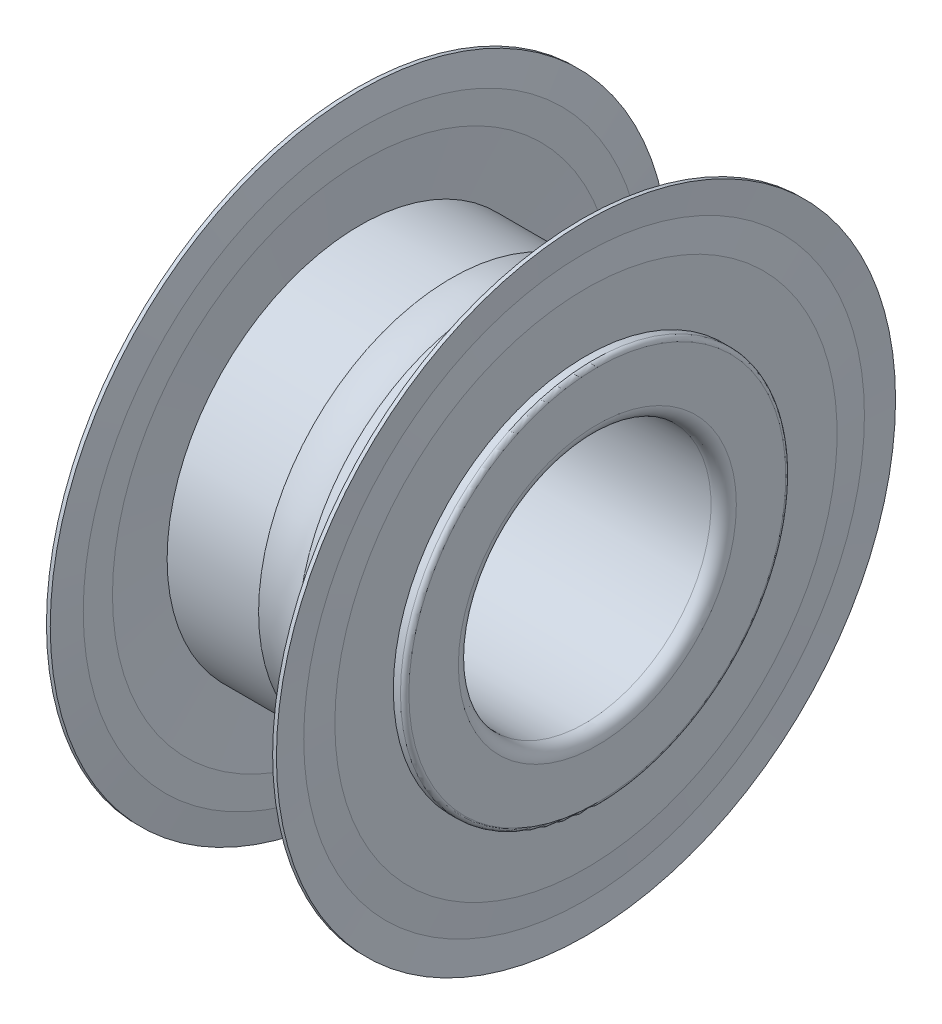
ISO-10303-21;
HEADER;
FILE_DESCRIPTION(('STEP AP214'),'2;1');
FILE_NAME('part.step','',(''),(''),'','','');
FILE_SCHEMA(('AUTOMOTIVE_DESIGN { 1 0 10303 214 1 1 1 1 }'));
ENDSEC;
DATA;
#1=APPLICATION_CONTEXT('core data for automotive mechanical design processes');
#2=APPLICATION_PROTOCOL_DEFINITION('international standard','automotive_design',2000,#1);
#3=PRODUCT_CONTEXT('',#1,'mechanical');
#4=PRODUCT('Part','Part','',(#3));
#5=PRODUCT_RELATED_PRODUCT_CATEGORY('part','',(#4));
#6=PRODUCT_DEFINITION_FORMATION('','',#4);
#7=PRODUCT_DEFINITION_CONTEXT('part definition',#1,'design');
#8=PRODUCT_DEFINITION('design','',#6,#7);
#9=PRODUCT_DEFINITION_SHAPE('','',#8);
#10=(LENGTH_UNIT() NAMED_UNIT(*) SI_UNIT(.MILLI.,.METRE.));
#11=(NAMED_UNIT(*) PLANE_ANGLE_UNIT() SI_UNIT($,.RADIAN.));
#12=(NAMED_UNIT(*) SI_UNIT($,.STERADIAN.) SOLID_ANGLE_UNIT());
#13=UNCERTAINTY_MEASURE_WITH_UNIT(LENGTH_MEASURE(1.E-05),#10,'distance_accuracy_value','');
#14=(GEOMETRIC_REPRESENTATION_CONTEXT(3) GLOBAL_UNCERTAINTY_ASSIGNED_CONTEXT((#13)) GLOBAL_UNIT_ASSIGNED_CONTEXT((#10,
#11,#12)) REPRESENTATION_CONTEXT('',''));
#15=CARTESIAN_POINT('',(0.,0.,0.));
#16=DIRECTION('',(0.,0.,1.));
#17=DIRECTION('',(1.,0.,0.));
#18=AXIS2_PLACEMENT_3D('',#15,#16,#17);
#19=CARTESIAN_POINT('',(50.,0.,0.));
#20=DIRECTION('',(-1.,0.,0.));
#21=DIRECTION('',(0.,0.,1.));
#22=AXIS2_PLACEMENT_3D('',#19,#20,#21);
#23=CYLINDRICAL_SURFACE('',#22,3.05);
#24=CARTESIAN_POINT('',(2.3122498999199,0.,0.));
#25=DIRECTION('',(-1.,0.,0.));
#26=DIRECTION('',(0.,0.,1.));
#27=AXIS2_PLACEMENT_3D('',#24,#25,#26);
#28=CIRCLE('',#27,3.05);
#29=CARTESIAN_POINT('',(2.3122498999199,0.,3.05));
#30=VERTEX_POINT('',#29);
#31=EDGE_CURVE('E76',#30,#30,#28,.T.);
#32=ORIENTED_EDGE('',*,*,#31,.F.);
#33=EDGE_LOOP('',(#32));
#34=FACE_BOUND('',#33,.T.);
#35=CARTESIAN_POINT('',(3.76,0.,0.));
#36=DIRECTION('',(-1.,0.,0.));
#37=DIRECTION('',(0.,0.,1.));
#38=AXIS2_PLACEMENT_3D('',#35,#36,#37);
#39=CIRCLE('',#38,3.05);
#40=CARTESIAN_POINT('',(3.76,0.,3.05));
#41=VERTEX_POINT('',#40);
#42=EDGE_CURVE('E10',#41,#41,#39,.F.);
#43=ORIENTED_EDGE('',*,*,#42,.F.);
#44=EDGE_LOOP('',(#43));
#45=FACE_BOUND('',#44,.T.);
#46=ADVANCED_FACE('F35',(#34,#45),#23,.T.);
#47=CARTESIAN_POINT('',(3.9333333333333,0.,0.));
#48=DIRECTION('',(-1.,0.,0.));
#49=DIRECTION('',(0.,0.,1.));
#50=AXIS2_PLACEMENT_3D('',#47,#48,#49);
#51=CIRCLE('',#50,3.05);
#52=CARTESIAN_POINT('',(3.9333333333333,0.,3.05));
#53=VERTEX_POINT('',#52);
#54=EDGE_CURVE('E73',#53,#53,#51,.T.);
#55=ORIENTED_EDGE('',*,*,#54,.T.);
#56=EDGE_LOOP('',(#55));
#57=FACE_BOUND('',#56,.T.);
#58=CARTESIAN_POINT('',(3.82,0.,0.));
#59=DIRECTION('',(-1.,0.,0.));
#60=DIRECTION('',(0.,0.,1.));
#61=AXIS2_PLACEMENT_3D('',#58,#59,#60);
#62=CIRCLE('',#61,3.05);
#63=CARTESIAN_POINT('',(3.82,0.,3.05));
#64=VERTEX_POINT('',#63);
#65=EDGE_CURVE('E42',#64,#64,#62,.T.);
#66=ORIENTED_EDGE('',*,*,#65,.F.);
#67=EDGE_LOOP('',(#66));
#68=FACE_BOUND('',#67,.T.);
#69=ADVANCED_FACE('F152',(#57,#68),#23,.T.);
#70=CARTESIAN_POINT('',(50.,0.,0.));
#71=DIRECTION('',(-1.,0.,0.));
#72=DIRECTION('',(0.,0.,1.));
#73=AXIS2_PLACEMENT_3D('',#70,#71,#72);
#74=CYLINDRICAL_SURFACE('',#73,3.05);
#75=CARTESIAN_POINT('',(0.0666666666666663,0.,0.));
#76=DIRECTION('',(-1.,0.,0.));
#77=DIRECTION('',(0.,0.,1.));
#78=AXIS2_PLACEMENT_3D('',#75,#76,#77);
#79=CIRCLE('',#78,3.05);
#80=CARTESIAN_POINT('',(0.0666666666666663,0.,3.05));
#81=VERTEX_POINT('',#80);
#82=EDGE_CURVE('E82',#81,#81,#79,.T.);
#83=ORIENTED_EDGE('',*,*,#82,.F.);
#84=EDGE_LOOP('',(#83));
#85=FACE_BOUND('',#84,.T.);
#86=CARTESIAN_POINT('',(0.18,0.,0.));
#87=DIRECTION('',(1.,0.,0.));
#88=DIRECTION('',(0.,0.,-1.));
#89=AXIS2_PLACEMENT_3D('',#86,#87,#88);
#90=CIRCLE('',#89,3.05);
#91=CARTESIAN_POINT('',(0.18,0.,-3.05));
#92=VERTEX_POINT('',#91);
#93=EDGE_CURVE('E46',#92,#92,#90,.T.);
#94=ORIENTED_EDGE('',*,*,#93,.F.);
#95=EDGE_LOOP('',(#94));
#96=FACE_BOUND('',#95,.T.);
#97=ADVANCED_FACE('F158',(#85,#96),#74,.T.);
#98=CARTESIAN_POINT('',(1.6877501000801,0.,0.));
#99=DIRECTION('',(-1.,0.,0.));
#100=DIRECTION('',(0.,0.,1.));
#101=AXIS2_PLACEMENT_3D('',#98,#99,#100);
#102=CIRCLE('',#101,3.05);
#103=CARTESIAN_POINT('',(1.6877501000801,0.,3.05));
#104=VERTEX_POINT('',#103);
#105=EDGE_CURVE('E79',#104,#104,#102,.T.);
#106=ORIENTED_EDGE('',*,*,#105,.T.);
#107=EDGE_LOOP('',(#106));
#108=FACE_BOUND('',#107,.T.);
#109=CARTESIAN_POINT('',(0.239999999999997,0.,0.));
#110=DIRECTION('',(1.,0.,0.));
#111=DIRECTION('',(0.,0.,-1.));
#112=AXIS2_PLACEMENT_3D('',#109,#110,#111);
#113=CIRCLE('',#112,3.05);
#114=CARTESIAN_POINT('',(0.239999999999997,0.,-3.05));
#115=VERTEX_POINT('',#114);
#116=EDGE_CURVE('E50',#115,#115,#113,.F.);
#117=ORIENTED_EDGE('',*,*,#116,.F.);
#118=EDGE_LOOP('',(#117));
#119=FACE_BOUND('',#118,.T.);
#120=ADVANCED_FACE('F191',(#108,#119),#74,.T.);
#121=CARTESIAN_POINT('',(0.0666666666667293,0.,0.));
#122=DIRECTION('',(-1.,0.,0.));
#123=DIRECTION('',(0.,0.,1.));
#124=AXIS2_PLACEMENT_3D('',#121,#122,#123);
#125=TOROIDAL_SURFACE('',#124,2.98333333333327,0.0666666666667295);
#126=CARTESIAN_POINT('',(0.,0.,0.));
#127=DIRECTION('',(-1.,0.,0.));
#128=DIRECTION('',(0.,0.,1.));
#129=AXIS2_PLACEMENT_3D('',#126,#127,#128);
#130=CIRCLE('',#129,2.9833333333333);
#131=CARTESIAN_POINT('',(0.,0.,2.9833333333333));
#132=VERTEX_POINT('',#131);
#133=EDGE_CURVE('E55',#132,#132,#130,.T.);
#134=ORIENTED_EDGE('',*,*,#133,.F.);
#135=EDGE_LOOP('',(#134));
#136=FACE_BOUND('',#135,.T.);
#137=ORIENTED_EDGE('',*,*,#82,.T.);
#138=EDGE_LOOP('',(#137));
#139=FACE_BOUND('',#138,.T.);
#140=ADVANCED_FACE('F37',(#136,#139),#125,.T.);
#141=CARTESIAN_POINT('',(0.,2.9833333333333,0.));
#142=DIRECTION('',(1.,0.,0.));
#143=DIRECTION('',(0.,0.,-1.));
#144=AXIS2_PLACEMENT_3D('',#141,#142,#143);
#145=PLANE('',#144);
#146=CARTESIAN_POINT('',(0.,0.,0.));
#147=DIRECTION('',(-1.,0.,0.));
#148=DIRECTION('',(0.,0.,1.));
#149=AXIS2_PLACEMENT_3D('',#146,#147,#148);
#150=CIRCLE('',#149,2.2);
#151=CARTESIAN_POINT('',(0.,0.,2.2));
#152=VERTEX_POINT('',#151);
#153=EDGE_CURVE('E58',#152,#152,#150,.T.);
#154=ORIENTED_EDGE('',*,*,#153,.F.);
#155=EDGE_LOOP('',(#154));
#156=FACE_BOUND('',#155,.T.);
#157=ORIENTED_EDGE('',*,*,#133,.T.);
#158=EDGE_LOOP('',(#157));
#159=FACE_BOUND('',#158,.T.);
#160=ADVANCED_FACE('F184',(#156,#159),#145,.F.);
#161=CARTESIAN_POINT('',(0.200000000000017,0.,0.));
#162=DIRECTION('',(-1.,0.,0.));
#163=DIRECTION('',(0.,0.,1.));
#164=AXIS2_PLACEMENT_3D('',#161,#162,#163);
#165=TOROIDAL_SURFACE('',#164,2.20000000000002,0.200000000000017);
#166=CARTESIAN_POINT('',(0.199999999999999,0.,0.));
#167=DIRECTION('',(-1.,0.,0.));
#168=DIRECTION('',(0.,0.,1.));
#169=AXIS2_PLACEMENT_3D('',#166,#167,#168);
#170=CIRCLE('',#169,2.);
#171=CARTESIAN_POINT('',(0.199999999999999,0.,2.));
#172=VERTEX_POINT('',#171);
#173=EDGE_CURVE('E61',#172,#172,#170,.T.);
#174=ORIENTED_EDGE('',*,*,#173,.F.);
#175=EDGE_LOOP('',(#174));
#176=FACE_BOUND('',#175,.T.);
#177=ORIENTED_EDGE('',*,*,#153,.T.);
#178=EDGE_LOOP('',(#177));
#179=FACE_BOUND('',#178,.T.);
#180=ADVANCED_FACE('F181',(#176,#179),#165,.T.);
#181=CARTESIAN_POINT('',(50.,0.,0.));
#182=DIRECTION('',(-1.,0.,0.));
#183=DIRECTION('',(0.,0.,1.));
#184=AXIS2_PLACEMENT_3D('',#181,#182,#183);
#185=CYLINDRICAL_SURFACE('',#184,2.);
#186=CARTESIAN_POINT('',(3.8,0.,0.));
#187=DIRECTION('',(-1.,0.,0.));
#188=DIRECTION('',(0.,0.,1.));
#189=AXIS2_PLACEMENT_3D('',#186,#187,#188);
#190=CIRCLE('',#189,2.);
#191=CARTESIAN_POINT('',(3.8,0.,2.));
#192=VERTEX_POINT('',#191);
#193=EDGE_CURVE('E64',#192,#192,#190,.T.);
#194=ORIENTED_EDGE('',*,*,#193,.F.);
#195=EDGE_LOOP('',(#194));
#196=FACE_BOUND('',#195,.T.);
#197=ORIENTED_EDGE('',*,*,#173,.T.);
#198=EDGE_LOOP('',(#197));
#199=FACE_BOUND('',#198,.T.);
#200=ADVANCED_FACE('F177',(#196,#199),#185,.F.);
#201=CARTESIAN_POINT('',(3.79999999999997,0.,0.));
#202=DIRECTION('',(-1.,0.,0.));
#203=DIRECTION('',(0.,0.,1.));
#204=AXIS2_PLACEMENT_3D('',#201,#202,#203);
#205=TOROIDAL_SURFACE('',#204,2.20000000000003,0.200000000000032);
#206=CARTESIAN_POINT('',(4.,0.,0.));
#207=DIRECTION('',(-1.,0.,0.));
#208=DIRECTION('',(0.,0.,1.));
#209=AXIS2_PLACEMENT_3D('',#206,#207,#208);
#210=CIRCLE('',#209,2.20000000000003);
#211=CARTESIAN_POINT('',(4.,0.,2.20000000000003));
#212=VERTEX_POINT('',#211);
#213=EDGE_CURVE('E67',#212,#212,#210,.T.);
#214=ORIENTED_EDGE('',*,*,#213,.F.);
#215=EDGE_LOOP('',(#214));
#216=FACE_BOUND('',#215,.T.);
#217=ORIENTED_EDGE('',*,*,#193,.T.);
#218=EDGE_LOOP('',(#217));
#219=FACE_BOUND('',#218,.T.);
#220=ADVANCED_FACE('F173',(#216,#219),#205,.T.);
#221=CARTESIAN_POINT('',(4.,2.19999999999997,0.));
#222=DIRECTION('',(-1.,0.,0.));
#223=DIRECTION('',(0.,0.,1.));
#224=AXIS2_PLACEMENT_3D('',#221,#222,#223);
#225=PLANE('',#224);
#226=CARTESIAN_POINT('',(4.,0.,0.));
#227=DIRECTION('',(-1.,0.,0.));
#228=DIRECTION('',(0.,0.,1.));
#229=AXIS2_PLACEMENT_3D('',#226,#227,#228);
#230=CIRCLE('',#229,2.9833333333333);
#231=CARTESIAN_POINT('',(4.,0.,2.9833333333333));
#232=VERTEX_POINT('',#231);
#233=EDGE_CURVE('E70',#232,#232,#230,.T.);
#234=ORIENTED_EDGE('',*,*,#233,.F.);
#235=EDGE_LOOP('',(#234));
#236=FACE_BOUND('',#235,.T.);
#237=ORIENTED_EDGE('',*,*,#213,.T.);
#238=EDGE_LOOP('',(#237));
#239=FACE_BOUND('',#238,.T.);
#240=ADVANCED_FACE('F169',(#236,#239),#225,.F.);
#241=CARTESIAN_POINT('',(3.93333333333321,0.,0.));
#242=DIRECTION('',(-1.,0.,0.));
#243=DIRECTION('',(0.,0.,1.));
#244=AXIS2_PLACEMENT_3D('',#241,#242,#243);
#245=TOROIDAL_SURFACE('',#244,2.98333333333321,0.0666666666667914);
#246=ORIENTED_EDGE('',*,*,#54,.F.);
#247=EDGE_LOOP('',(#246));
#248=FACE_BOUND('',#247,.T.);
#249=ORIENTED_EDGE('',*,*,#233,.T.);
#250=EDGE_LOOP('',(#249));
#251=FACE_BOUND('',#250,.T.);
#252=ADVANCED_FACE('F166',(#248,#251),#245,.T.);
#253=CARTESIAN_POINT('',(2.,0.,0.));
#254=DIRECTION('',(-1.,0.,0.));
#255=DIRECTION('',(0.,0.,1.));
#256=AXIS2_PLACEMENT_3D('',#253,#254,#255);
#257=TOROIDAL_SURFACE('',#256,3.99999999999988,0.999999999999884);
#258=ORIENTED_EDGE('',*,*,#105,.F.);
#259=EDGE_LOOP('',(#258));
#260=FACE_BOUND('',#259,.T.);
#261=ORIENTED_EDGE('',*,*,#31,.T.);
#262=EDGE_LOOP('',(#261));
#263=FACE_BOUND('',#262,.T.);
#264=ADVANCED_FACE('F164',(#260,#263),#257,.F.);
#265=CARTESIAN_POINT('',(50.,0.,0.));
#266=DIRECTION('',(-1.,0.,0.));
#267=DIRECTION('',(0.,0.,1.));
#268=AXIS2_PLACEMENT_3D('',#265,#266,#267);
#269=CYLINDRICAL_SURFACE('',#268,4.9);
#270=CARTESIAN_POINT('',(0.18,0.,0.));
#271=DIRECTION('',(-1.,0.,0.));
#272=DIRECTION('',(0.,0.,1.));
#273=AXIS2_PLACEMENT_3D('',#270,#271,#272);
#274=CIRCLE('',#273,4.9);
#275=CARTESIAN_POINT('',(0.18,0.,4.9));
#276=VERTEX_POINT('',#275);
#277=EDGE_CURVE('E85',#276,#276,#274,.T.);
#278=ORIENTED_EDGE('',*,*,#277,.F.);
#279=EDGE_LOOP('',(#278));
#280=FACE_BOUND('',#279,.T.);
#281=CARTESIAN_POINT('',(0.239999999999997,0.,0.));
#282=DIRECTION('',(-1.,0.,0.));
#283=DIRECTION('',(0.,0.,1.));
#284=AXIS2_PLACEMENT_3D('',#281,#282,#283);
#285=CIRCLE('',#284,4.9);
#286=CARTESIAN_POINT('',(0.239999999999997,0.,4.9));
#287=VERTEX_POINT('',#286);
#288=EDGE_CURVE('E100',#287,#287,#285,.T.);
#289=ORIENTED_EDGE('',*,*,#288,.T.);
#290=EDGE_LOOP('',(#289));
#291=FACE_BOUND('',#290,.T.);
#292=ADVANCED_FACE('F219',(#280,#291),#269,.T.);
#293=CARTESIAN_POINT('',(0.18,0.,0.));
#294=DIRECTION('',(-1.,0.,0.));
#295=DIRECTION('',(0.,0.,1.));
#296=AXIS2_PLACEMENT_3D('',#293,#294,#295);
#297=CONICAL_SURFACE('',#296,4.9,1.50602220486897);
#298=CARTESIAN_POINT('',(0.210000000000002,0.,0.));
#299=DIRECTION('',(-1.,0.,0.));
#300=DIRECTION('',(0.,0.,1.));
#301=AXIS2_PLACEMENT_3D('',#298,#299,#300);
#302=CIRCLE('',#301,4.4375);
#303=CARTESIAN_POINT('',(0.210000000000002,0.,4.4375));
#304=VERTEX_POINT('',#303);
#305=EDGE_CURVE('E88',#304,#304,#302,.T.);
#306=ORIENTED_EDGE('',*,*,#305,.F.);
#307=EDGE_LOOP('',(#306));
#308=FACE_BOUND('',#307,.T.);
#309=ORIENTED_EDGE('',*,*,#277,.T.);
#310=EDGE_LOOP('',(#309));
#311=FACE_BOUND('',#310,.T.);
#312=ADVANCED_FACE('F213',(#308,#311),#297,.F.);
#313=CARTESIAN_POINT('',(0.210000000000002,0.,0.));
#314=DIRECTION('',(1.,0.,0.));
#315=DIRECTION('',(0.,0.,-1.));
#316=AXIS2_PLACEMENT_3D('',#313,#314,#315);
#317=CONICAL_SURFACE('',#316,4.4375,1.50602220486897);
#318=CARTESIAN_POINT('',(0.18,0.,0.));
#319=DIRECTION('',(-1.,0.,0.));
#320=DIRECTION('',(0.,0.,1.));
#321=AXIS2_PLACEMENT_3D('',#318,#319,#320);
#322=CIRCLE('',#321,3.975);
#323=CARTESIAN_POINT('',(0.18,0.,3.975));
#324=VERTEX_POINT('',#323);
#325=EDGE_CURVE('E91',#324,#324,#322,.T.);
#326=ORIENTED_EDGE('',*,*,#325,.F.);
#327=EDGE_LOOP('',(#326));
#328=FACE_BOUND('',#327,.T.);
#329=ORIENTED_EDGE('',*,*,#305,.T.);
#330=EDGE_LOOP('',(#329));
#331=FACE_BOUND('',#330,.T.);
#332=ADVANCED_FACE('F207',(#328,#331),#317,.T.);
#333=CARTESIAN_POINT('',(0.18,3.975,0.));
#334=DIRECTION('',(1.,0.,0.));
#335=DIRECTION('',(0.,0.,-1.));
#336=AXIS2_PLACEMENT_3D('',#333,#334,#335);
#337=PLANE('',#336);
#338=ORIENTED_EDGE('',*,*,#93,.T.);
#339=EDGE_LOOP('',(#338));
#340=FACE_BOUND('',#339,.T.);
#341=ORIENTED_EDGE('',*,*,#325,.T.);
#342=EDGE_LOOP('',(#341));
#343=FACE_BOUND('',#342,.T.);
#344=ADVANCED_FACE('F203',(#340,#343),#337,.F.);
#345=CARTESIAN_POINT('',(0.239999999999997,0.,0.));
#346=DIRECTION('',(1.,0.,0.));
#347=DIRECTION('',(0.,0.,-1.));
#348=AXIS2_PLACEMENT_3D('',#345,#346,#347);
#349=CONICAL_SURFACE('',#348,3.05,1.50602220486897);
#350=CARTESIAN_POINT('',(0.300000000000002,0.,0.));
#351=DIRECTION('',(-1.,0.,0.));
#352=DIRECTION('',(0.,0.,1.));
#353=AXIS2_PLACEMENT_3D('',#350,#351,#352);
#354=CIRCLE('',#353,3.975);
#355=CARTESIAN_POINT('',(0.300000000000002,0.,3.975));
#356=VERTEX_POINT('',#355);
#357=EDGE_CURVE('E94',#356,#356,#354,.T.);
#358=ORIENTED_EDGE('',*,*,#357,.F.);
#359=EDGE_LOOP('',(#358));
#360=FACE_BOUND('',#359,.T.);
#361=ORIENTED_EDGE('',*,*,#116,.T.);
#362=EDGE_LOOP('',(#361));
#363=FACE_BOUND('',#362,.T.);
#364=ADVANCED_FACE('F206',(#360,#363),#349,.F.);
#365=CARTESIAN_POINT('',(0.3,3.975,0.));
#366=DIRECTION('',(-1.,0.,0.));
#367=DIRECTION('',(0.,0.,1.));
#368=AXIS2_PLACEMENT_3D('',#365,#366,#367);
#369=PLANE('',#368);
#370=CARTESIAN_POINT('',(0.300000000000002,0.,0.));
#371=DIRECTION('',(-1.,0.,0.));
#372=DIRECTION('',(0.,0.,1.));
#373=AXIS2_PLACEMENT_3D('',#370,#371,#372);
#374=CIRCLE('',#373,4.4375);
#375=CARTESIAN_POINT('',(0.300000000000002,0.,4.4375));
#376=VERTEX_POINT('',#375);
#377=EDGE_CURVE('E97',#376,#376,#374,.T.);
#378=ORIENTED_EDGE('',*,*,#377,.F.);
#379=EDGE_LOOP('',(#378));
#380=FACE_BOUND('',#379,.T.);
#381=ORIENTED_EDGE('',*,*,#357,.T.);
#382=EDGE_LOOP('',(#381));
#383=FACE_BOUND('',#382,.T.);
#384=ADVANCED_FACE('F231',(#380,#383),#369,.F.);
#385=CARTESIAN_POINT('',(0.300000000000002,0.,0.));
#386=DIRECTION('',(-1.,0.,0.));
#387=DIRECTION('',(0.,0.,1.));
#388=AXIS2_PLACEMENT_3D('',#385,#386,#387);
#389=CONICAL_SURFACE('',#388,4.4375,1.44178711053551);
#390=ORIENTED_EDGE('',*,*,#288,.F.);
#391=EDGE_LOOP('',(#390));
#392=FACE_BOUND('',#391,.T.);
#393=ORIENTED_EDGE('',*,*,#377,.T.);
#394=EDGE_LOOP('',(#393));
#395=FACE_BOUND('',#394,.T.);
#396=ADVANCED_FACE('F228',(#392,#395),#389,.T.);
#397=CARTESIAN_POINT('',(3.76,0.,0.));
#398=DIRECTION('',(1.,0.,0.));
#399=DIRECTION('',(0.,0.,-1.));
#400=AXIS2_PLACEMENT_3D('',#397,#398,#399);
#401=CONICAL_SURFACE('',#400,4.9,1.44178711053552);
#402=CARTESIAN_POINT('',(3.7,0.,0.));
#403=DIRECTION('',(-1.,0.,0.));
#404=DIRECTION('',(0.,0.,1.));
#405=AXIS2_PLACEMENT_3D('',#402,#403,#404);
#406=CIRCLE('',#405,4.4375);
#407=CARTESIAN_POINT('',(3.7,0.,4.4375));
#408=VERTEX_POINT('',#407);
#409=EDGE_CURVE('E103',#408,#408,#406,.T.);
#410=ORIENTED_EDGE('',*,*,#409,.F.);
#411=EDGE_LOOP('',(#410));
#412=FACE_BOUND('',#411,.T.);
#413=CARTESIAN_POINT('',(3.76,0.,0.));
#414=DIRECTION('',(-1.,0.,0.));
#415=DIRECTION('',(0.,0.,1.));
#416=AXIS2_PLACEMENT_3D('',#413,#414,#415);
#417=CIRCLE('',#416,4.9);
#418=CARTESIAN_POINT('',(3.76,0.,4.9));
#419=VERTEX_POINT('',#418);
#420=EDGE_CURVE('E118',#419,#419,#417,.T.);
#421=ORIENTED_EDGE('',*,*,#420,.T.);
#422=EDGE_LOOP('',(#421));
#423=FACE_BOUND('',#422,.T.);
#424=ADVANCED_FACE('F122',(#412,#423),#401,.T.);
#425=CARTESIAN_POINT('',(3.7,4.4375,0.));
#426=DIRECTION('',(1.,0.,0.));
#427=DIRECTION('',(0.,0.,-1.));
#428=AXIS2_PLACEMENT_3D('',#425,#426,#427);
#429=PLANE('',#428);
#430=CARTESIAN_POINT('',(3.7,0.,0.));
#431=DIRECTION('',(-1.,0.,0.));
#432=DIRECTION('',(0.,0.,1.));
#433=AXIS2_PLACEMENT_3D('',#430,#431,#432);
#434=CIRCLE('',#433,3.975);
#435=CARTESIAN_POINT('',(3.7,0.,3.975));
#436=VERTEX_POINT('',#435);
#437=EDGE_CURVE('E106',#436,#436,#434,.T.);
#438=ORIENTED_EDGE('',*,*,#437,.F.);
#439=EDGE_LOOP('',(#438));
#440=FACE_BOUND('',#439,.T.);
#441=ORIENTED_EDGE('',*,*,#409,.T.);
#442=EDGE_LOOP('',(#441));
#443=FACE_BOUND('',#442,.T.);
#444=ADVANCED_FACE('F149',(#440,#443),#429,.F.);
#445=CARTESIAN_POINT('',(3.7,0.,0.));
#446=DIRECTION('',(-1.,0.,0.));
#447=DIRECTION('',(0.,0.,1.));
#448=AXIS2_PLACEMENT_3D('',#445,#446,#447);
#449=CONICAL_SURFACE('',#448,3.975,1.50602220486898);
#450=ORIENTED_EDGE('',*,*,#42,.T.);
#451=EDGE_LOOP('',(#450));
#452=FACE_BOUND('',#451,.T.);
#453=ORIENTED_EDGE('',*,*,#437,.T.);
#454=EDGE_LOOP('',(#453));
#455=FACE_BOUND('',#454,.T.);
#456=ADVANCED_FACE('F144',(#452,#455),#449,.F.);
#457=CARTESIAN_POINT('',(3.82,3.05,0.));
#458=DIRECTION('',(-1.,0.,0.));
#459=DIRECTION('',(0.,0.,1.));
#460=AXIS2_PLACEMENT_3D('',#457,#458,#459);
#461=PLANE('',#460);
#462=CARTESIAN_POINT('',(3.82,0.,0.));
#463=DIRECTION('',(-1.,0.,0.));
#464=DIRECTION('',(0.,0.,1.));
#465=AXIS2_PLACEMENT_3D('',#462,#463,#464);
#466=CIRCLE('',#465,3.975);
#467=CARTESIAN_POINT('',(3.82,0.,3.975));
#468=VERTEX_POINT('',#467);
#469=EDGE_CURVE('E109',#468,#468,#466,.T.);
#470=ORIENTED_EDGE('',*,*,#469,.F.);
#471=EDGE_LOOP('',(#470));
#472=FACE_BOUND('',#471,.T.);
#473=ORIENTED_EDGE('',*,*,#65,.T.);
#474=EDGE_LOOP('',(#473));
#475=FACE_BOUND('',#474,.T.);
#476=ADVANCED_FACE('F139',(#472,#475),#461,.F.);
#477=CARTESIAN_POINT('',(3.82,0.,0.));
#478=DIRECTION('',(-1.,0.,0.));
#479=DIRECTION('',(0.,0.,1.));
#480=AXIS2_PLACEMENT_3D('',#477,#478,#479);
#481=CONICAL_SURFACE('',#480,3.975,1.50602220486899);
#482=CARTESIAN_POINT('',(3.79,0.,0.));
#483=DIRECTION('',(-1.,0.,0.));
#484=DIRECTION('',(0.,0.,1.));
#485=AXIS2_PLACEMENT_3D('',#482,#483,#484);
#486=CIRCLE('',#485,4.4375);
#487=CARTESIAN_POINT('',(3.79,0.,4.4375));
#488=VERTEX_POINT('',#487);
#489=EDGE_CURVE('E112',#488,#488,#486,.T.);
#490=ORIENTED_EDGE('',*,*,#489,.F.);
#491=EDGE_LOOP('',(#490));
#492=FACE_BOUND('',#491,.T.);
#493=ORIENTED_EDGE('',*,*,#469,.T.);
#494=EDGE_LOOP('',(#493));
#495=FACE_BOUND('',#494,.T.);
#496=ADVANCED_FACE('F133',(#492,#495),#481,.T.);
#497=CARTESIAN_POINT('',(3.79,0.,0.));
#498=DIRECTION('',(1.,0.,0.));
#499=DIRECTION('',(0.,0.,-1.));
#500=AXIS2_PLACEMENT_3D('',#497,#498,#499);
#501=CONICAL_SURFACE('',#500,4.4375,1.50602220486899);
#502=CARTESIAN_POINT('',(3.82,0.,0.));
#503=DIRECTION('',(-1.,0.,0.));
#504=DIRECTION('',(0.,0.,1.));
#505=AXIS2_PLACEMENT_3D('',#502,#503,#504);
#506=CIRCLE('',#505,4.9);
#507=CARTESIAN_POINT('',(3.82,0.,4.9));
#508=VERTEX_POINT('',#507);
#509=EDGE_CURVE('E115',#508,#508,#506,.T.);
#510=ORIENTED_EDGE('',*,*,#509,.F.);
#511=EDGE_LOOP('',(#510));
#512=FACE_BOUND('',#511,.T.);
#513=ORIENTED_EDGE('',*,*,#489,.T.);
#514=EDGE_LOOP('',(#513));
#515=FACE_BOUND('',#514,.T.);
#516=ADVANCED_FACE('F127',(#512,#515),#501,.F.);
#517=CARTESIAN_POINT('',(50.,0.,0.));
#518=DIRECTION('',(-1.,0.,0.));
#519=DIRECTION('',(0.,0.,1.));
#520=AXIS2_PLACEMENT_3D('',#517,#518,#519);
#521=CYLINDRICAL_SURFACE('',#520,4.9);
#522=ORIENTED_EDGE('',*,*,#420,.F.);
#523=EDGE_LOOP('',(#522));
#524=FACE_BOUND('',#523,.T.);
#525=ORIENTED_EDGE('',*,*,#509,.T.);
#526=EDGE_LOOP('',(#525));
#527=FACE_BOUND('',#526,.T.);
#528=ADVANCED_FACE('F124',(#524,#527),#521,.T.);
#529=CLOSED_SHELL('',(#46,#69,#97,#120,#140,#160,#180,#200,#220,#240,#252,#264,#292,#312,#332,
#344,#364,#384,#396,#424,#444,#456,#476,#496,#516,#528));
#530=MANIFOLD_SOLID_BREP('B2',#529);
#531=ADVANCED_BREP_SHAPE_REPRESENTATION('',(#18,#530),#14);
#532=SHAPE_DEFINITION_REPRESENTATION(#9,#531);
ENDSEC;
END-ISO-10303-21;
